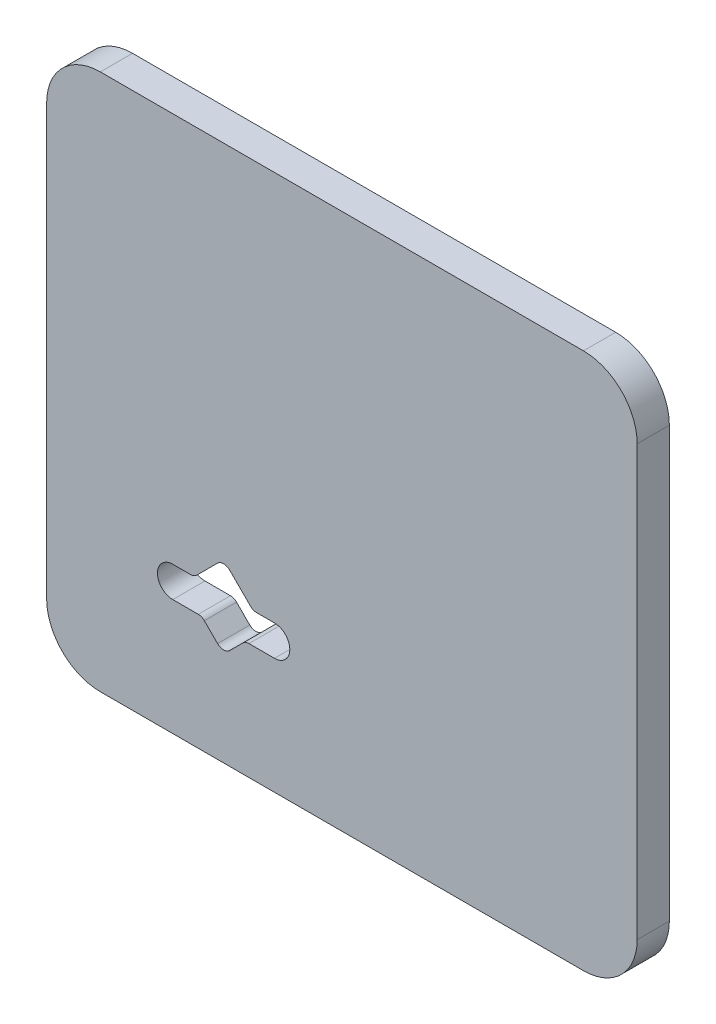
ISO-10303-21;
HEADER;
FILE_DESCRIPTION(('STEP AP214'),'2;1');
FILE_NAME('part.step','',(''),(''),'','','');
FILE_SCHEMA(('AUTOMOTIVE_DESIGN { 1 0 10303 214 1 1 1 1 }'));
ENDSEC;
DATA;
#1=APPLICATION_CONTEXT('core data for automotive mechanical design processes');
#2=APPLICATION_PROTOCOL_DEFINITION('international standard','automotive_design',2000,#1);
#3=PRODUCT_CONTEXT('',#1,'mechanical');
#4=PRODUCT('Part','Part','',(#3));
#5=PRODUCT_RELATED_PRODUCT_CATEGORY('part','',(#4));
#6=PRODUCT_DEFINITION_FORMATION('','',#4);
#7=PRODUCT_DEFINITION_CONTEXT('part definition',#1,'design');
#8=PRODUCT_DEFINITION('design','',#6,#7);
#9=PRODUCT_DEFINITION_SHAPE('','',#8);
#10=(LENGTH_UNIT() NAMED_UNIT(*) SI_UNIT(.MILLI.,.METRE.));
#11=(NAMED_UNIT(*) PLANE_ANGLE_UNIT() SI_UNIT($,.RADIAN.));
#12=(NAMED_UNIT(*) SI_UNIT($,.STERADIAN.) SOLID_ANGLE_UNIT());
#13=UNCERTAINTY_MEASURE_WITH_UNIT(LENGTH_MEASURE(1.E-05),#10,'distance_accuracy_value','');
#14=(GEOMETRIC_REPRESENTATION_CONTEXT(3) GLOBAL_UNCERTAINTY_ASSIGNED_CONTEXT((#13)) GLOBAL_UNIT_ASSIGNED_CONTEXT((#10,
#11,#12)) REPRESENTATION_CONTEXT('',''));
#15=CARTESIAN_POINT('',(0.,0.,0.));
#16=DIRECTION('',(0.,0.,1.));
#17=DIRECTION('',(1.,0.,0.));
#18=AXIS2_PLACEMENT_3D('',#15,#16,#17);
#19=CARTESIAN_POINT('',(6.34999999999999,61.1641820195664,-3.81));
#20=DIRECTION('',(0.,0.,1.));
#21=DIRECTION('',(1.,0.,0.));
#22=AXIS2_PLACEMENT_3D('',#19,#20,#21);
#23=CYLINDRICAL_SURFACE('',#22,6.35);
#24=CARTESIAN_POINT('',(6.34999999999999,61.1641820195664,0.));
#25=DIRECTION('',(0.,0.,1.));
#26=DIRECTION('',(-1.,0.,0.));
#27=AXIS2_PLACEMENT_3D('',#24,#25,#26);
#28=CIRCLE('',#27,6.35);
#29=CARTESIAN_POINT('',(6.34999999999999,67.5141820195664,0.));
#30=VERTEX_POINT('',#29);
#31=CARTESIAN_POINT('',(0.,61.1641820195664,0.));
#32=VERTEX_POINT('',#31);
#33=EDGE_CURVE('E297',#30,#32,#28,.T.);
#34=ORIENTED_EDGE('',*,*,#33,.F.);
#35=DIRECTION('',(0.,0.,1.));
#36=VECTOR('',#35,1.);
#37=CARTESIAN_POINT('',(6.34999999999999,67.5141820195664,-3.81));
#38=LINE('',#37,#36);
#39=CARTESIAN_POINT('',(6.34999999999999,67.5141820195664,-3.81));
#40=VERTEX_POINT('',#39);
#41=EDGE_CURVE('E11',#40,#30,#38,.T.);
#42=ORIENTED_EDGE('',*,*,#41,.F.);
#43=CARTESIAN_POINT('',(6.34999999999999,61.1641820195664,-3.81));
#44=DIRECTION('',(0.,0.,1.));
#45=DIRECTION('',(-1.,0.,0.));
#46=AXIS2_PLACEMENT_3D('',#43,#44,#45);
#47=CIRCLE('',#46,6.35);
#48=CARTESIAN_POINT('',(0.,61.1641820195664,-3.81));
#49=VERTEX_POINT('',#48);
#50=EDGE_CURVE('E325',#40,#49,#47,.T.);
#51=ORIENTED_EDGE('',*,*,#50,.T.);
#52=DIRECTION('',(0.,0.,1.));
#53=VECTOR('',#52,1.);
#54=CARTESIAN_POINT('',(0.,61.1641820195664,-3.81));
#55=LINE('',#54,#53);
#56=EDGE_CURVE('E34',#49,#32,#55,.T.);
#57=ORIENTED_EDGE('',*,*,#56,.T.);
#58=EDGE_LOOP('',(#34,#42,#51,#57));
#59=FACE_BOUND('',#58,.T.);
#60=ADVANCED_FACE('F31',(#59),#23,.T.);
#61=CARTESIAN_POINT('',(6.34999999999999,67.5141820195664,-3.81));
#62=DIRECTION('',(0.,1.,0.));
#63=DIRECTION('',(0.,0.,1.));
#64=AXIS2_PLACEMENT_3D('',#61,#62,#63);
#65=PLANE('',#64);
#66=DIRECTION('',(-1.,0.,0.));
#67=VECTOR('',#66,1.);
#68=CARTESIAN_POINT('',(6.34999999999999,67.5141820195664,0.));
#69=LINE('',#68,#67);
#70=CARTESIAN_POINT('',(63.5,67.5141820195664,0.));
#71=VERTEX_POINT('',#70);
#72=EDGE_CURVE('E329',#71,#30,#69,.T.);
#73=ORIENTED_EDGE('',*,*,#72,.F.);
#74=DIRECTION('',(0.,0.,1.));
#75=VECTOR('',#74,1.);
#76=CARTESIAN_POINT('',(63.5,67.5141820195664,-3.81));
#77=LINE('',#76,#75);
#78=CARTESIAN_POINT('',(63.5,67.5141820195664,-3.81));
#79=VERTEX_POINT('',#78);
#80=EDGE_CURVE('E39',#79,#71,#77,.T.);
#81=ORIENTED_EDGE('',*,*,#80,.F.);
#82=DIRECTION('',(-1.,0.,0.));
#83=VECTOR('',#82,1.);
#84=CARTESIAN_POINT('',(6.34999999999999,67.5141820195664,-3.81));
#85=LINE('',#84,#83);
#86=EDGE_CURVE('E347',#79,#40,#85,.T.);
#87=ORIENTED_EDGE('',*,*,#86,.T.);
#88=ORIENTED_EDGE('',*,*,#41,.T.);
#89=EDGE_LOOP('',(#73,#81,#87,#88));
#90=FACE_BOUND('',#89,.T.);
#91=ADVANCED_FACE('F394',(#90),#65,.T.);
#92=CARTESIAN_POINT('',(63.5,61.1641820195664,-3.81));
#93=DIRECTION('',(0.,0.,1.));
#94=DIRECTION('',(1.,0.,0.));
#95=AXIS2_PLACEMENT_3D('',#92,#93,#94);
#96=CYLINDRICAL_SURFACE('',#95,6.35);
#97=CARTESIAN_POINT('',(63.5,61.1641820195664,0.));
#98=DIRECTION('',(0.,0.,1.));
#99=DIRECTION('',(1.,0.,0.));
#100=AXIS2_PLACEMENT_3D('',#97,#98,#99);
#101=CIRCLE('',#100,6.35);
#102=CARTESIAN_POINT('',(69.85,61.1641820195664,0.));
#103=VERTEX_POINT('',#102);
#104=EDGE_CURVE('E367',#103,#71,#101,.T.);
#105=ORIENTED_EDGE('',*,*,#104,.F.);
#106=DIRECTION('',(0.,0.,1.));
#107=VECTOR('',#106,1.);
#108=CARTESIAN_POINT('',(69.85,61.1641820195664,-3.81));
#109=LINE('',#108,#107);
#110=CARTESIAN_POINT('',(69.85,61.1641820195664,-3.81));
#111=VERTEX_POINT('',#110);
#112=EDGE_CURVE('E373',#111,#103,#109,.T.);
#113=ORIENTED_EDGE('',*,*,#112,.F.);
#114=CARTESIAN_POINT('',(63.5,61.1641820195664,-3.81));
#115=DIRECTION('',(0.,0.,1.));
#116=DIRECTION('',(1.,0.,0.));
#117=AXIS2_PLACEMENT_3D('',#114,#115,#116);
#118=CIRCLE('',#117,6.35);
#119=EDGE_CURVE('E344',#111,#79,#118,.T.);
#120=ORIENTED_EDGE('',*,*,#119,.T.);
#121=ORIENTED_EDGE('',*,*,#80,.T.);
#122=EDGE_LOOP('',(#105,#113,#120,#121));
#123=FACE_BOUND('',#122,.T.);
#124=ADVANCED_FACE('F413',(#123),#96,.T.);
#125=CARTESIAN_POINT('',(69.85,61.1641820195664,-3.81));
#126=DIRECTION('',(1.,0.,0.));
#127=DIRECTION('',(0.,1.,0.));
#128=AXIS2_PLACEMENT_3D('',#125,#126,#127);
#129=PLANE('',#128);
#130=DIRECTION('',(0.,1.,0.));
#131=VECTOR('',#130,1.);
#132=CARTESIAN_POINT('',(69.85,61.1641820195664,0.));
#133=LINE('',#132,#131);
#134=CARTESIAN_POINT('',(69.85,10.3641820195664,0.));
#135=VERTEX_POINT('',#134);
#136=EDGE_CURVE('E364',#135,#103,#133,.T.);
#137=ORIENTED_EDGE('',*,*,#136,.F.);
#138=DIRECTION('',(0.,0.,1.));
#139=VECTOR('',#138,1.);
#140=CARTESIAN_POINT('',(69.85,10.3641820195664,-3.81));
#141=LINE('',#140,#139);
#142=CARTESIAN_POINT('',(69.85,10.3641820195664,-3.81));
#143=VERTEX_POINT('',#142);
#144=EDGE_CURVE('E375',#143,#135,#141,.T.);
#145=ORIENTED_EDGE('',*,*,#144,.F.);
#146=DIRECTION('',(0.,1.,0.));
#147=VECTOR('',#146,1.);
#148=CARTESIAN_POINT('',(69.85,61.1641820195664,-3.81));
#149=LINE('',#148,#147);
#150=EDGE_CURVE('E341',#143,#111,#149,.T.);
#151=ORIENTED_EDGE('',*,*,#150,.T.);
#152=ORIENTED_EDGE('',*,*,#112,.T.);
#153=EDGE_LOOP('',(#137,#145,#151,#152));
#154=FACE_BOUND('',#153,.T.);
#155=ADVANCED_FACE('F411',(#154),#129,.T.);
#156=CARTESIAN_POINT('',(63.5,10.3641820195664,-3.81));
#157=DIRECTION('',(0.,0.,1.));
#158=DIRECTION('',(1.,0.,0.));
#159=AXIS2_PLACEMENT_3D('',#156,#157,#158);
#160=CYLINDRICAL_SURFACE('',#159,6.35);
#161=CARTESIAN_POINT('',(63.5,10.3641820195664,0.));
#162=DIRECTION('',(0.,0.,1.));
#163=DIRECTION('',(1.,0.,0.));
#164=AXIS2_PLACEMENT_3D('',#161,#162,#163);
#165=CIRCLE('',#164,6.35);
#166=CARTESIAN_POINT('',(63.5,4.01418201956642,0.));
#167=VERTEX_POINT('',#166);
#168=EDGE_CURVE('E361',#167,#135,#165,.T.);
#169=ORIENTED_EDGE('',*,*,#168,.F.);
#170=DIRECTION('',(0.,0.,1.));
#171=VECTOR('',#170,1.);
#172=CARTESIAN_POINT('',(63.5,4.01418201956642,-3.81));
#173=LINE('',#172,#171);
#174=CARTESIAN_POINT('',(63.5,4.01418201956642,-3.81));
#175=VERTEX_POINT('',#174);
#176=EDGE_CURVE('E377',#175,#167,#173,.T.);
#177=ORIENTED_EDGE('',*,*,#176,.F.);
#178=CARTESIAN_POINT('',(63.5,10.3641820195664,-3.81));
#179=DIRECTION('',(0.,0.,1.));
#180=DIRECTION('',(1.,0.,0.));
#181=AXIS2_PLACEMENT_3D('',#178,#179,#180);
#182=CIRCLE('',#181,6.35);
#183=EDGE_CURVE('E338',#175,#143,#182,.T.);
#184=ORIENTED_EDGE('',*,*,#183,.T.);
#185=ORIENTED_EDGE('',*,*,#144,.T.);
#186=EDGE_LOOP('',(#169,#177,#184,#185));
#187=FACE_BOUND('',#186,.T.);
#188=ADVANCED_FACE('F407',(#187),#160,.T.);
#189=CARTESIAN_POINT('',(63.5,4.01418201956642,-3.81));
#190=DIRECTION('',(0.,-1.,0.));
#191=DIRECTION('',(1.,0.,0.));
#192=AXIS2_PLACEMENT_3D('',#189,#190,#191);
#193=PLANE('',#192);
#194=DIRECTION('',(1.,0.,0.));
#195=VECTOR('',#194,1.);
#196=CARTESIAN_POINT('',(63.5,4.01418201956642,0.));
#197=LINE('',#196,#195);
#198=CARTESIAN_POINT('',(6.35000000000004,4.01418201956642,0.));
#199=VERTEX_POINT('',#198);
#200=EDGE_CURVE('E358',#199,#167,#197,.T.);
#201=ORIENTED_EDGE('',*,*,#200,.F.);
#202=DIRECTION('',(0.,0.,1.));
#203=VECTOR('',#202,1.);
#204=CARTESIAN_POINT('',(6.35000000000004,4.01418201956642,-3.81));
#205=LINE('',#204,#203);
#206=CARTESIAN_POINT('',(6.35000000000004,4.01418201956642,-3.81));
#207=VERTEX_POINT('',#206);
#208=EDGE_CURVE('E379',#207,#199,#205,.T.);
#209=ORIENTED_EDGE('',*,*,#208,.F.);
#210=DIRECTION('',(1.,0.,0.));
#211=VECTOR('',#210,1.);
#212=CARTESIAN_POINT('',(63.5,4.01418201956642,-3.81));
#213=LINE('',#212,#211);
#214=EDGE_CURVE('E335',#207,#175,#213,.T.);
#215=ORIENTED_EDGE('',*,*,#214,.T.);
#216=ORIENTED_EDGE('',*,*,#176,.T.);
#217=EDGE_LOOP('',(#201,#209,#215,#216));
#218=FACE_BOUND('',#217,.T.);
#219=ADVANCED_FACE('F405',(#218),#193,.T.);
#220=CARTESIAN_POINT('',(6.35,10.3641820195664,-3.81));
#221=DIRECTION('',(0.,0.,1.));
#222=DIRECTION('',(1.,0.,0.));
#223=AXIS2_PLACEMENT_3D('',#220,#221,#222);
#224=CYLINDRICAL_SURFACE('',#223,6.35);
#225=CARTESIAN_POINT('',(6.35,10.3641820195664,0.));
#226=DIRECTION('',(0.,0.,1.));
#227=DIRECTION('',(1.,0.,0.));
#228=AXIS2_PLACEMENT_3D('',#225,#226,#227);
#229=CIRCLE('',#228,6.35);
#230=CARTESIAN_POINT('',(0.,10.3641820195665,0.));
#231=VERTEX_POINT('',#230);
#232=EDGE_CURVE('E355',#231,#199,#229,.T.);
#233=ORIENTED_EDGE('',*,*,#232,.F.);
#234=DIRECTION('',(0.,0.,1.));
#235=VECTOR('',#234,1.);
#236=CARTESIAN_POINT('',(0.,10.3641820195665,-3.81));
#237=LINE('',#236,#235);
#238=CARTESIAN_POINT('',(0.,10.3641820195665,-3.81));
#239=VERTEX_POINT('',#238);
#240=EDGE_CURVE('E380',#239,#231,#237,.T.);
#241=ORIENTED_EDGE('',*,*,#240,.F.);
#242=CARTESIAN_POINT('',(6.35,10.3641820195664,-3.81));
#243=DIRECTION('',(0.,0.,1.));
#244=DIRECTION('',(1.,0.,0.));
#245=AXIS2_PLACEMENT_3D('',#242,#243,#244);
#246=CIRCLE('',#245,6.35);
#247=EDGE_CURVE('E332',#239,#207,#246,.T.);
#248=ORIENTED_EDGE('',*,*,#247,.T.);
#249=ORIENTED_EDGE('',*,*,#208,.T.);
#250=EDGE_LOOP('',(#233,#241,#248,#249));
#251=FACE_BOUND('',#250,.T.);
#252=ADVANCED_FACE('F401',(#251),#224,.T.);
#253=CARTESIAN_POINT('',(0.,10.3641820195665,-3.81));
#254=DIRECTION('',(-1.,0.,0.));
#255=DIRECTION('',(0.,-1.,0.));
#256=AXIS2_PLACEMENT_3D('',#253,#254,#255);
#257=PLANE('',#256);
#258=DIRECTION('',(0.,-1.,0.));
#259=VECTOR('',#258,1.);
#260=CARTESIAN_POINT('',(0.,10.3641820195665,0.));
#261=LINE('',#260,#259);
#262=EDGE_CURVE('E352',#32,#231,#261,.T.);
#263=ORIENTED_EDGE('',*,*,#262,.F.);
#264=ORIENTED_EDGE('',*,*,#56,.F.);
#265=DIRECTION('',(0.,-1.,0.));
#266=VECTOR('',#265,1.);
#267=CARTESIAN_POINT('',(0.,10.3641820195665,-3.81));
#268=LINE('',#267,#266);
#269=EDGE_CURVE('E328',#49,#239,#268,.T.);
#270=ORIENTED_EDGE('',*,*,#269,.T.);
#271=ORIENTED_EDGE('',*,*,#240,.T.);
#272=EDGE_LOOP('',(#263,#264,#270,#271));
#273=FACE_BOUND('',#272,.T.);
#274=ADVANCED_FACE('F388',(#273),#257,.T.);
#275=CARTESIAN_POINT('',(6.34999999999999,61.1641820195664,-3.81));
#276=DIRECTION('',(0.,0.,-1.));
#277=DIRECTION('',(-1.,0.,0.));
#278=AXIS2_PLACEMENT_3D('',#275,#276,#277);
#279=PLANE('',#278);
#280=CARTESIAN_POINT('',(26.9522558544265,19.5518149122751,-3.81));
#281=DIRECTION('',(0.,0.,1.));
#282=DIRECTION('',(1.,0.,0.));
#283=AXIS2_PLACEMENT_3D('',#280,#281,#282);
#284=CIRCLE('',#283,1.80981111499001);
#285=CARTESIAN_POINT('',(26.9522558544265,17.7420037972851,-3.81));
#286=VERTEX_POINT('',#285);
#287=CARTESIAN_POINT('',(26.9522558544265,21.3616260272651,-3.81));
#288=VERTEX_POINT('',#287);
#289=EDGE_CURVE('E194',#286,#288,#284,.T.);
#290=ORIENTED_EDGE('',*,*,#289,.T.);
#291=DIRECTION('',(-1.,0.,0.));
#292=VECTOR('',#291,1.);
#293=CARTESIAN_POINT('',(24.8330968337976,21.3616260272651,-3.81));
#294=LINE('',#293,#292);
#295=CARTESIAN_POINT('',(24.8330968337976,21.3616260272651,-3.81));
#296=VERTEX_POINT('',#295);
#297=EDGE_CURVE('E203',#288,#296,#294,.T.);
#298=ORIENTED_EDGE('',*,*,#297,.T.);
#299=CARTESIAN_POINT('',(24.8330968337976,22.3776260272651,-3.81));
#300=DIRECTION('',(0.,0.,-1.));
#301=DIRECTION('',(1.,0.,0.));
#302=AXIS2_PLACEMENT_3D('',#299,#300,#301);
#303=CIRCLE('',#302,1.016);
#304=CARTESIAN_POINT('',(24.114676344112,21.6592055375796,-3.81));
#305=VERTEX_POINT('',#304);
#306=EDGE_CURVE('E47',#296,#305,#303,.T.);
#307=ORIENTED_EDGE('',*,*,#306,.T.);
#308=DIRECTION('',(-0.707106781186548,0.707106781186546,0.));
#309=VECTOR('',#308,1.);
#310=CARTESIAN_POINT('',(24.114676344112,21.6592055375796,-3.81));
#311=LINE('',#310,#309);
#312=CARTESIAN_POINT('',(21.6527611399269,24.1211207417647,-3.81));
#313=VERTEX_POINT('',#312);
#314=EDGE_CURVE('E218',#305,#313,#311,.T.);
#315=ORIENTED_EDGE('',*,*,#314,.T.);
#316=CARTESIAN_POINT('',(20.9343406502414,23.4027002520792,-3.81));
#317=DIRECTION('',(0.,0.,1.));
#318=DIRECTION('',(-1.,0.,0.));
#319=AXIS2_PLACEMENT_3D('',#316,#317,#318);
#320=CIRCLE('',#319,1.016);
#321=CARTESIAN_POINT('',(20.2159201605558,24.1211207417647,-3.81));
#322=VERTEX_POINT('',#321);
#323=EDGE_CURVE('E221',#313,#322,#320,.T.);
#324=ORIENTED_EDGE('',*,*,#323,.T.);
#325=DIRECTION('',(-0.707106781186547,-0.707106781186547,0.));
#326=VECTOR('',#325,1.);
#327=CARTESIAN_POINT('',(20.2159201605558,24.1211207417647,-3.81));
#328=LINE('',#327,#326);
#329=CARTESIAN_POINT('',(17.7540049563707,21.6592055375796,-3.81));
#330=VERTEX_POINT('',#329);
#331=EDGE_CURVE('E224',#322,#330,#328,.T.);
#332=ORIENTED_EDGE('',*,*,#331,.T.);
#333=CARTESIAN_POINT('',(17.0355844666852,22.3776260272651,-3.81));
#334=DIRECTION('',(0.,0.,-1.));
#335=DIRECTION('',(-1.,0.,0.));
#336=AXIS2_PLACEMENT_3D('',#333,#334,#335);
#337=CIRCLE('',#336,1.016);
#338=CARTESIAN_POINT('',(17.0355844666852,21.3616260272651,-3.81));
#339=VERTEX_POINT('',#338);
#340=EDGE_CURVE('E227',#330,#339,#337,.T.);
#341=ORIENTED_EDGE('',*,*,#340,.T.);
#342=DIRECTION('',(-1.,0.,0.));
#343=VECTOR('',#342,1.);
#344=CARTESIAN_POINT('',(14.9164254460562,21.3616260272651,-3.81));
#345=LINE('',#344,#343);
#346=CARTESIAN_POINT('',(14.9164254460562,21.3616260272651,-3.81));
#347=VERTEX_POINT('',#346);
#348=EDGE_CURVE('E230',#339,#347,#345,.T.);
#349=ORIENTED_EDGE('',*,*,#348,.T.);
#350=CARTESIAN_POINT('',(14.9164254460562,19.5518149122751,-3.81));
#351=DIRECTION('',(0.,0.,1.));
#352=DIRECTION('',(1.,0.,0.));
#353=AXIS2_PLACEMENT_3D('',#350,#351,#352);
#354=CIRCLE('',#353,1.80981111499001);
#355=CARTESIAN_POINT('',(14.9164254460562,17.7420037972851,-3.81));
#356=VERTEX_POINT('',#355);
#357=EDGE_CURVE('E233',#347,#356,#354,.T.);
#358=ORIENTED_EDGE('',*,*,#357,.T.);
#359=DIRECTION('',(1.,0.,0.));
#360=VECTOR('',#359,1.);
#361=CARTESIAN_POINT('',(14.9164254460562,17.7420037972851,-3.81));
#362=LINE('',#361,#360);
#363=CARTESIAN_POINT('',(17.9383929701685,17.7420037972851,-3.81));
#364=VERTEX_POINT('',#363);
#365=EDGE_CURVE('E236',#356,#364,#362,.T.);
#366=ORIENTED_EDGE('',*,*,#365,.T.);
#367=CARTESIAN_POINT('',(17.9383929701685,16.7260037972851,-3.81));
#368=DIRECTION('',(0.,0.,-1.));
#369=DIRECTION('',(1.,0.,0.));
#370=AXIS2_PLACEMENT_3D('',#367,#368,#369);
#371=CIRCLE('',#370,1.016);
#372=CARTESIAN_POINT('',(18.656813459854,17.4444242869706,-3.81));
#373=VERTEX_POINT('',#372);
#374=EDGE_CURVE('E239',#364,#373,#371,.T.);
#375=ORIENTED_EDGE('',*,*,#374,.T.);
#376=DIRECTION('',(0.707106781186548,-0.707106781186548,0.));
#377=VECTOR('',#376,1.);
#378=CARTESIAN_POINT('',(18.656813459854,17.4444242869706,-3.81));
#379=LINE('',#378,#377);
#380=CARTESIAN_POINT('',(20.2159201605558,15.8853175862688,-3.81));
#381=VERTEX_POINT('',#380);
#382=EDGE_CURVE('E242',#373,#381,#379,.T.);
#383=ORIENTED_EDGE('',*,*,#382,.T.);
#384=CARTESIAN_POINT('',(20.9343406502414,16.6037380759543,-3.81));
#385=DIRECTION('',(0.,0.,1.));
#386=DIRECTION('',(1.,0.,0.));
#387=AXIS2_PLACEMENT_3D('',#384,#385,#386);
#388=CIRCLE('',#387,1.016);
#389=CARTESIAN_POINT('',(21.6527611399269,15.8853175862688,-3.81));
#390=VERTEX_POINT('',#389);
#391=EDGE_CURVE('E245',#381,#390,#388,.T.);
#392=ORIENTED_EDGE('',*,*,#391,.T.);
#393=DIRECTION('',(0.707106781186546,0.707106781186549,0.));
#394=VECTOR('',#393,1.);
#395=CARTESIAN_POINT('',(21.6527611399269,15.8853175862688,-3.81));
#396=LINE('',#395,#394);
#397=CARTESIAN_POINT('',(23.2118678406287,17.4444242869706,-3.81));
#398=VERTEX_POINT('',#397);
#399=EDGE_CURVE('E248',#390,#398,#396,.T.);
#400=ORIENTED_EDGE('',*,*,#399,.T.);
#401=CARTESIAN_POINT('',(23.9302883303142,16.7260037972851,-3.81));
#402=DIRECTION('',(0.,0.,-1.));
#403=DIRECTION('',(-1.,0.,0.));
#404=AXIS2_PLACEMENT_3D('',#401,#402,#403);
#405=CIRCLE('',#404,1.016);
#406=CARTESIAN_POINT('',(23.9302883303142,17.7420037972851,-3.81));
#407=VERTEX_POINT('',#406);
#408=EDGE_CURVE('E251',#398,#407,#405,.T.);
#409=ORIENTED_EDGE('',*,*,#408,.T.);
#410=DIRECTION('',(1.,0.,0.));
#411=VECTOR('',#410,1.);
#412=CARTESIAN_POINT('',(23.9302883303142,17.7420037972851,-3.81));
#413=LINE('',#412,#411);
#414=EDGE_CURVE('E200',#407,#286,#413,.T.);
#415=ORIENTED_EDGE('',*,*,#414,.T.);
#416=EDGE_LOOP('',(#290,#298,#307,#315,#324,#332,#341,#349,#358,#366,#375,#383,#392,#400,#409,#415));
#417=FACE_BOUND('',#416,.T.);
#418=ORIENTED_EDGE('',*,*,#50,.F.);
#419=ORIENTED_EDGE('',*,*,#86,.F.);
#420=ORIENTED_EDGE('',*,*,#119,.F.);
#421=ORIENTED_EDGE('',*,*,#150,.F.);
#422=ORIENTED_EDGE('',*,*,#183,.F.);
#423=ORIENTED_EDGE('',*,*,#214,.F.);
#424=ORIENTED_EDGE('',*,*,#247,.F.);
#425=ORIENTED_EDGE('',*,*,#269,.F.);
#426=EDGE_LOOP('',(#418,#419,#420,#421,#422,#423,#424,#425));
#427=FACE_BOUND('',#426,.T.);
#428=ADVANCED_FACE('F207',(#417,#427),#279,.T.);
#429=CARTESIAN_POINT('',(6.34999999999999,61.1641820195664,0.));
#430=DIRECTION('',(0.,0.,-1.));
#431=DIRECTION('',(-1.,0.,0.));
#432=AXIS2_PLACEMENT_3D('',#429,#430,#431);
#433=PLANE('',#432);
#434=DIRECTION('',(-1.,0.,0.));
#435=VECTOR('',#434,1.);
#436=CARTESIAN_POINT('',(24.8330968337976,21.3616260272651,0.));
#437=LINE('',#436,#435);
#438=CARTESIAN_POINT('',(26.9522558544265,21.3616260272651,0.));
#439=VERTEX_POINT('',#438);
#440=CARTESIAN_POINT('',(24.8330968337976,21.3616260272651,0.));
#441=VERTEX_POINT('',#440);
#442=EDGE_CURVE('E255',#439,#441,#437,.T.);
#443=ORIENTED_EDGE('',*,*,#442,.F.);
#444=CARTESIAN_POINT('',(26.9522558544265,19.5518149122751,0.));
#445=DIRECTION('',(0.,0.,1.));
#446=DIRECTION('',(1.,0.,0.));
#447=AXIS2_PLACEMENT_3D('',#444,#445,#446);
#448=CIRCLE('',#447,1.80981111499001);
#449=CARTESIAN_POINT('',(26.9522558544265,17.7420037972851,0.));
#450=VERTEX_POINT('',#449);
#451=EDGE_CURVE('E55',#450,#439,#448,.T.);
#452=ORIENTED_EDGE('',*,*,#451,.F.);
#453=DIRECTION('',(1.,0.,0.));
#454=VECTOR('',#453,1.);
#455=CARTESIAN_POINT('',(23.9302883303142,17.7420037972851,0.));
#456=LINE('',#455,#454);
#457=CARTESIAN_POINT('',(23.9302883303142,17.7420037972851,0.));
#458=VERTEX_POINT('',#457);
#459=EDGE_CURVE('E211',#458,#450,#456,.T.);
#460=ORIENTED_EDGE('',*,*,#459,.F.);
#461=CARTESIAN_POINT('',(23.9302883303142,16.7260037972851,0.));
#462=DIRECTION('',(0.,0.,-1.));
#463=DIRECTION('',(-1.,0.,0.));
#464=AXIS2_PLACEMENT_3D('',#461,#462,#463);
#465=CIRCLE('',#464,1.016);
#466=CARTESIAN_POINT('',(23.2118678406287,17.4444242869706,0.));
#467=VERTEX_POINT('',#466);
#468=EDGE_CURVE('E214',#467,#458,#465,.T.);
#469=ORIENTED_EDGE('',*,*,#468,.F.);
#470=DIRECTION('',(0.707106781186546,0.707106781186549,0.));
#471=VECTOR('',#470,1.);
#472=CARTESIAN_POINT('',(21.6527611399269,15.8853175862688,0.));
#473=LINE('',#472,#471);
#474=CARTESIAN_POINT('',(21.6527611399269,15.8853175862688,0.));
#475=VERTEX_POINT('',#474);
#476=EDGE_CURVE('E290',#475,#467,#473,.T.);
#477=ORIENTED_EDGE('',*,*,#476,.F.);
#478=CARTESIAN_POINT('',(20.9343406502414,16.6037380759543,0.));
#479=DIRECTION('',(0.,0.,1.));
#480=DIRECTION('',(1.,0.,0.));
#481=AXIS2_PLACEMENT_3D('',#478,#479,#480);
#482=CIRCLE('',#481,1.016);
#483=CARTESIAN_POINT('',(20.2159201605558,15.8853175862688,0.));
#484=VERTEX_POINT('',#483);
#485=EDGE_CURVE('E287',#484,#475,#482,.T.);
#486=ORIENTED_EDGE('',*,*,#485,.F.);
#487=DIRECTION('',(0.707106781186548,-0.707106781186548,0.));
#488=VECTOR('',#487,1.);
#489=CARTESIAN_POINT('',(18.656813459854,17.4444242869706,0.));
#490=LINE('',#489,#488);
#491=CARTESIAN_POINT('',(18.656813459854,17.4444242869706,0.));
#492=VERTEX_POINT('',#491);
#493=EDGE_CURVE('E284',#492,#484,#490,.T.);
#494=ORIENTED_EDGE('',*,*,#493,.F.);
#495=CARTESIAN_POINT('',(17.9383929701685,16.7260037972851,0.));
#496=DIRECTION('',(0.,0.,-1.));
#497=DIRECTION('',(1.,0.,0.));
#498=AXIS2_PLACEMENT_3D('',#495,#496,#497);
#499=CIRCLE('',#498,1.016);
#500=CARTESIAN_POINT('',(17.9383929701685,17.7420037972851,0.));
#501=VERTEX_POINT('',#500);
#502=EDGE_CURVE('E281',#501,#492,#499,.T.);
#503=ORIENTED_EDGE('',*,*,#502,.F.);
#504=DIRECTION('',(1.,0.,0.));
#505=VECTOR('',#504,1.);
#506=CARTESIAN_POINT('',(14.9164254460562,17.7420037972851,0.));
#507=LINE('',#506,#505);
#508=CARTESIAN_POINT('',(14.9164254460562,17.7420037972851,0.));
#509=VERTEX_POINT('',#508);
#510=EDGE_CURVE('E278',#509,#501,#507,.T.);
#511=ORIENTED_EDGE('',*,*,#510,.F.);
#512=CARTESIAN_POINT('',(14.9164254460562,19.5518149122751,0.));
#513=DIRECTION('',(0.,0.,1.));
#514=DIRECTION('',(1.,0.,0.));
#515=AXIS2_PLACEMENT_3D('',#512,#513,#514);
#516=CIRCLE('',#515,1.80981111499001);
#517=CARTESIAN_POINT('',(14.9164254460562,21.3616260272651,0.));
#518=VERTEX_POINT('',#517);
#519=EDGE_CURVE('E275',#518,#509,#516,.T.);
#520=ORIENTED_EDGE('',*,*,#519,.F.);
#521=DIRECTION('',(-1.,0.,0.));
#522=VECTOR('',#521,1.);
#523=CARTESIAN_POINT('',(14.9164254460562,21.3616260272651,0.));
#524=LINE('',#523,#522);
#525=CARTESIAN_POINT('',(17.0355844666852,21.3616260272651,0.));
#526=VERTEX_POINT('',#525);
#527=EDGE_CURVE('E272',#526,#518,#524,.T.);
#528=ORIENTED_EDGE('',*,*,#527,.F.);
#529=CARTESIAN_POINT('',(17.0355844666852,22.3776260272651,0.));
#530=DIRECTION('',(0.,0.,-1.));
#531=DIRECTION('',(-1.,0.,0.));
#532=AXIS2_PLACEMENT_3D('',#529,#530,#531);
#533=CIRCLE('',#532,1.016);
#534=CARTESIAN_POINT('',(17.7540049563707,21.6592055375796,0.));
#535=VERTEX_POINT('',#534);
#536=EDGE_CURVE('E269',#535,#526,#533,.T.);
#537=ORIENTED_EDGE('',*,*,#536,.F.);
#538=DIRECTION('',(-0.707106781186547,-0.707106781186547,0.));
#539=VECTOR('',#538,1.);
#540=CARTESIAN_POINT('',(20.2159201605558,24.1211207417647,0.));
#541=LINE('',#540,#539);
#542=CARTESIAN_POINT('',(20.2159201605558,24.1211207417647,0.));
#543=VERTEX_POINT('',#542);
#544=EDGE_CURVE('E266',#543,#535,#541,.T.);
#545=ORIENTED_EDGE('',*,*,#544,.F.);
#546=CARTESIAN_POINT('',(20.9343406502414,23.4027002520792,0.));
#547=DIRECTION('',(0.,0.,1.));
#548=DIRECTION('',(-1.,0.,0.));
#549=AXIS2_PLACEMENT_3D('',#546,#547,#548);
#550=CIRCLE('',#549,1.016);
#551=CARTESIAN_POINT('',(21.6527611399269,24.1211207417647,0.));
#552=VERTEX_POINT('',#551);
#553=EDGE_CURVE('E263',#552,#543,#550,.T.);
#554=ORIENTED_EDGE('',*,*,#553,.F.);
#555=DIRECTION('',(-0.707106781186548,0.707106781186546,0.));
#556=VECTOR('',#555,1.);
#557=CARTESIAN_POINT('',(24.114676344112,21.6592055375796,0.));
#558=LINE('',#557,#556);
#559=CARTESIAN_POINT('',(24.114676344112,21.6592055375796,0.));
#560=VERTEX_POINT('',#559);
#561=EDGE_CURVE('E260',#560,#552,#558,.T.);
#562=ORIENTED_EDGE('',*,*,#561,.F.);
#563=CARTESIAN_POINT('',(24.8330968337976,22.3776260272651,0.));
#564=DIRECTION('',(0.,0.,-1.));
#565=DIRECTION('',(1.,0.,0.));
#566=AXIS2_PLACEMENT_3D('',#563,#564,#565);
#567=CIRCLE('',#566,1.016);
#568=EDGE_CURVE('E257',#441,#560,#567,.T.);
#569=ORIENTED_EDGE('',*,*,#568,.F.);
#570=EDGE_LOOP('',(#443,#452,#460,#469,#477,#486,#494,#503,#511,#520,#528,#537,#545,#554,#562,#569));
#571=FACE_BOUND('',#570,.T.);
#572=ORIENTED_EDGE('',*,*,#33,.T.);
#573=ORIENTED_EDGE('',*,*,#262,.T.);
#574=ORIENTED_EDGE('',*,*,#232,.T.);
#575=ORIENTED_EDGE('',*,*,#200,.T.);
#576=ORIENTED_EDGE('',*,*,#168,.T.);
#577=ORIENTED_EDGE('',*,*,#136,.T.);
#578=ORIENTED_EDGE('',*,*,#104,.T.);
#579=ORIENTED_EDGE('',*,*,#72,.T.);
#580=EDGE_LOOP('',(#572,#573,#574,#575,#576,#577,#578,#579));
#581=FACE_BOUND('',#580,.T.);
#582=ADVANCED_FACE('F390',(#571,#581),#433,.F.);
#583=CARTESIAN_POINT('',(26.9522558544265,19.5518149122751,-3.81));
#584=DIRECTION('',(0.,0.,1.));
#585=DIRECTION('',(1.,0.,0.));
#586=AXIS2_PLACEMENT_3D('',#583,#584,#585);
#587=CYLINDRICAL_SURFACE('',#586,1.80981111499001);
#588=ORIENTED_EDGE('',*,*,#451,.T.);
#589=DIRECTION('',(0.,0.,1.));
#590=VECTOR('',#589,1.);
#591=CARTESIAN_POINT('',(26.9522558544265,21.3616260272651,-3.81));
#592=LINE('',#591,#590);
#593=EDGE_CURVE('E190',#288,#439,#592,.T.);
#594=ORIENTED_EDGE('',*,*,#593,.F.);
#595=ORIENTED_EDGE('',*,*,#289,.F.);
#596=DIRECTION('',(0.,0.,1.));
#597=VECTOR('',#596,1.);
#598=CARTESIAN_POINT('',(26.9522558544265,17.7420037972851,-3.81));
#599=LINE('',#598,#597);
#600=EDGE_CURVE('E295',#286,#450,#599,.T.);
#601=ORIENTED_EDGE('',*,*,#600,.T.);
#602=EDGE_LOOP('',(#588,#594,#595,#601));
#603=FACE_BOUND('',#602,.T.);
#604=ADVANCED_FACE('F192',(#603),#587,.F.);
#605=CARTESIAN_POINT('',(23.9302883303142,17.7420037972851,-3.81));
#606=DIRECTION('',(0.,-1.,0.));
#607=DIRECTION('',(0.,0.,-1.));
#608=AXIS2_PLACEMENT_3D('',#605,#606,#607);
#609=PLANE('',#608);
#610=ORIENTED_EDGE('',*,*,#459,.T.);
#611=ORIENTED_EDGE('',*,*,#600,.F.);
#612=ORIENTED_EDGE('',*,*,#414,.F.);
#613=DIRECTION('',(0.,0.,1.));
#614=VECTOR('',#613,1.);
#615=CARTESIAN_POINT('',(23.9302883303142,17.7420037972851,-3.81));
#616=LINE('',#615,#614);
#617=EDGE_CURVE('E298',#407,#458,#616,.T.);
#618=ORIENTED_EDGE('',*,*,#617,.T.);
#619=EDGE_LOOP('',(#610,#611,#612,#618));
#620=FACE_BOUND('',#619,.T.);
#621=ADVANCED_FACE('F496',(#620),#609,.F.);
#622=CARTESIAN_POINT('',(23.9302883303142,16.7260037972851,-3.81));
#623=DIRECTION('',(0.,0.,1.));
#624=DIRECTION('',(1.,0.,0.));
#625=AXIS2_PLACEMENT_3D('',#622,#623,#624);
#626=CYLINDRICAL_SURFACE('',#625,1.016);
#627=ORIENTED_EDGE('',*,*,#468,.T.);
#628=ORIENTED_EDGE('',*,*,#617,.F.);
#629=ORIENTED_EDGE('',*,*,#408,.F.);
#630=DIRECTION('',(0.,0.,1.));
#631=VECTOR('',#630,1.);
#632=CARTESIAN_POINT('',(23.2118678406287,17.4444242869706,-3.81));
#633=LINE('',#632,#631);
#634=EDGE_CURVE('E300',#398,#467,#633,.T.);
#635=ORIENTED_EDGE('',*,*,#634,.T.);
#636=EDGE_LOOP('',(#627,#628,#629,#635));
#637=FACE_BOUND('',#636,.T.);
#638=ADVANCED_FACE('F505',(#637),#626,.T.);
#639=CARTESIAN_POINT('',(21.6527611399269,15.8853175862688,-3.81));
#640=DIRECTION('',(0.707106781186549,-0.707106781186546,0.));
#641=DIRECTION('',(0.707106781186546,0.707106781186549,0.));
#642=AXIS2_PLACEMENT_3D('',#639,#640,#641);
#643=PLANE('',#642);
#644=ORIENTED_EDGE('',*,*,#476,.T.);
#645=ORIENTED_EDGE('',*,*,#634,.F.);
#646=ORIENTED_EDGE('',*,*,#399,.F.);
#647=DIRECTION('',(0.,0.,1.));
#648=VECTOR('',#647,1.);
#649=CARTESIAN_POINT('',(21.6527611399269,15.8853175862688,-3.81));
#650=LINE('',#649,#648);
#651=EDGE_CURVE('E302',#390,#475,#650,.T.);
#652=ORIENTED_EDGE('',*,*,#651,.T.);
#653=EDGE_LOOP('',(#644,#645,#646,#652));
#654=FACE_BOUND('',#653,.T.);
#655=ADVANCED_FACE('F515',(#654),#643,.F.);
#656=CARTESIAN_POINT('',(20.9343406502414,16.6037380759543,-3.81));
#657=DIRECTION('',(0.,0.,1.));
#658=DIRECTION('',(1.,0.,0.));
#659=AXIS2_PLACEMENT_3D('',#656,#657,#658);
#660=CYLINDRICAL_SURFACE('',#659,1.016);
#661=ORIENTED_EDGE('',*,*,#485,.T.);
#662=ORIENTED_EDGE('',*,*,#651,.F.);
#663=ORIENTED_EDGE('',*,*,#391,.F.);
#664=DIRECTION('',(0.,0.,1.));
#665=VECTOR('',#664,1.);
#666=CARTESIAN_POINT('',(20.2159201605558,15.8853175862688,-3.81));
#667=LINE('',#666,#665);
#668=EDGE_CURVE('E304',#381,#484,#667,.T.);
#669=ORIENTED_EDGE('',*,*,#668,.T.);
#670=EDGE_LOOP('',(#661,#662,#663,#669));
#671=FACE_BOUND('',#670,.T.);
#672=ADVANCED_FACE('F525',(#671),#660,.F.);
#673=CARTESIAN_POINT('',(18.656813459854,17.4444242869706,-3.81));
#674=DIRECTION('',(-0.707106781186548,-0.707106781186548,0.));
#675=DIRECTION('',(0.707106781186548,-0.707106781186548,0.));
#676=AXIS2_PLACEMENT_3D('',#673,#674,#675);
#677=PLANE('',#676);
#678=ORIENTED_EDGE('',*,*,#493,.T.);
#679=ORIENTED_EDGE('',*,*,#668,.F.);
#680=ORIENTED_EDGE('',*,*,#382,.F.);
#681=DIRECTION('',(0.,0.,1.));
#682=VECTOR('',#681,1.);
#683=CARTESIAN_POINT('',(18.656813459854,17.4444242869706,-3.81));
#684=LINE('',#683,#682);
#685=EDGE_CURVE('E306',#373,#492,#684,.T.);
#686=ORIENTED_EDGE('',*,*,#685,.T.);
#687=EDGE_LOOP('',(#678,#679,#680,#686));
#688=FACE_BOUND('',#687,.T.);
#689=ADVANCED_FACE('F535',(#688),#677,.F.);
#690=CARTESIAN_POINT('',(17.9383929701685,16.7260037972851,-3.81));
#691=DIRECTION('',(0.,0.,1.));
#692=DIRECTION('',(1.,0.,0.));
#693=AXIS2_PLACEMENT_3D('',#690,#691,#692);
#694=CYLINDRICAL_SURFACE('',#693,1.016);
#695=ORIENTED_EDGE('',*,*,#502,.T.);
#696=ORIENTED_EDGE('',*,*,#685,.F.);
#697=ORIENTED_EDGE('',*,*,#374,.F.);
#698=DIRECTION('',(0.,0.,1.));
#699=VECTOR('',#698,1.);
#700=CARTESIAN_POINT('',(17.9383929701685,17.7420037972851,-3.81));
#701=LINE('',#700,#699);
#702=EDGE_CURVE('E308',#364,#501,#701,.T.);
#703=ORIENTED_EDGE('',*,*,#702,.T.);
#704=EDGE_LOOP('',(#695,#696,#697,#703));
#705=FACE_BOUND('',#704,.T.);
#706=ADVANCED_FACE('F545',(#705),#694,.T.);
#707=CARTESIAN_POINT('',(14.9164254460562,17.7420037972851,-3.81));
#708=DIRECTION('',(0.,-1.,0.));
#709=DIRECTION('',(0.,0.,-1.));
#710=AXIS2_PLACEMENT_3D('',#707,#708,#709);
#711=PLANE('',#710);
#712=ORIENTED_EDGE('',*,*,#510,.T.);
#713=ORIENTED_EDGE('',*,*,#702,.F.);
#714=ORIENTED_EDGE('',*,*,#365,.F.);
#715=DIRECTION('',(0.,0.,1.));
#716=VECTOR('',#715,1.);
#717=CARTESIAN_POINT('',(14.9164254460562,17.7420037972851,-3.81));
#718=LINE('',#717,#716);
#719=EDGE_CURVE('E310',#356,#509,#718,.T.);
#720=ORIENTED_EDGE('',*,*,#719,.T.);
#721=EDGE_LOOP('',(#712,#713,#714,#720));
#722=FACE_BOUND('',#721,.T.);
#723=ADVANCED_FACE('F555',(#722),#711,.F.);
#724=CARTESIAN_POINT('',(14.9164254460562,19.5518149122751,-3.81));
#725=DIRECTION('',(0.,0.,1.));
#726=DIRECTION('',(1.,0.,0.));
#727=AXIS2_PLACEMENT_3D('',#724,#725,#726);
#728=CYLINDRICAL_SURFACE('',#727,1.80981111499001);
#729=ORIENTED_EDGE('',*,*,#519,.T.);
#730=ORIENTED_EDGE('',*,*,#719,.F.);
#731=ORIENTED_EDGE('',*,*,#357,.F.);
#732=DIRECTION('',(0.,0.,1.));
#733=VECTOR('',#732,1.);
#734=CARTESIAN_POINT('',(14.9164254460562,21.3616260272651,-3.81));
#735=LINE('',#734,#733);
#736=EDGE_CURVE('E312',#347,#518,#735,.T.);
#737=ORIENTED_EDGE('',*,*,#736,.T.);
#738=EDGE_LOOP('',(#729,#730,#731,#737));
#739=FACE_BOUND('',#738,.T.);
#740=ADVANCED_FACE('F565',(#739),#728,.F.);
#741=CARTESIAN_POINT('',(14.9164254460562,21.3616260272651,-3.81));
#742=DIRECTION('',(0.,1.,0.));
#743=DIRECTION('',(0.,0.,1.));
#744=AXIS2_PLACEMENT_3D('',#741,#742,#743);
#745=PLANE('',#744);
#746=ORIENTED_EDGE('',*,*,#527,.T.);
#747=ORIENTED_EDGE('',*,*,#736,.F.);
#748=ORIENTED_EDGE('',*,*,#348,.F.);
#749=DIRECTION('',(0.,0.,1.));
#750=VECTOR('',#749,1.);
#751=CARTESIAN_POINT('',(17.0355844666852,21.3616260272651,-3.81));
#752=LINE('',#751,#750);
#753=EDGE_CURVE('E314',#339,#526,#752,.T.);
#754=ORIENTED_EDGE('',*,*,#753,.T.);
#755=EDGE_LOOP('',(#746,#747,#748,#754));
#756=FACE_BOUND('',#755,.T.);
#757=ADVANCED_FACE('F575',(#756),#745,.F.);
#758=CARTESIAN_POINT('',(17.0355844666852,22.3776260272651,-3.81));
#759=DIRECTION('',(0.,0.,1.));
#760=DIRECTION('',(1.,0.,0.));
#761=AXIS2_PLACEMENT_3D('',#758,#759,#760);
#762=CYLINDRICAL_SURFACE('',#761,1.016);
#763=ORIENTED_EDGE('',*,*,#536,.T.);
#764=ORIENTED_EDGE('',*,*,#753,.F.);
#765=ORIENTED_EDGE('',*,*,#340,.F.);
#766=DIRECTION('',(0.,0.,1.));
#767=VECTOR('',#766,1.);
#768=CARTESIAN_POINT('',(17.7540049563707,21.6592055375796,-3.81));
#769=LINE('',#768,#767);
#770=EDGE_CURVE('E316',#330,#535,#769,.T.);
#771=ORIENTED_EDGE('',*,*,#770,.T.);
#772=EDGE_LOOP('',(#763,#764,#765,#771));
#773=FACE_BOUND('',#772,.T.);
#774=ADVANCED_FACE('F585',(#773),#762,.T.);
#775=CARTESIAN_POINT('',(20.2159201605558,24.1211207417647,-3.81));
#776=DIRECTION('',(-0.707106781186548,0.707106781186548,0.));
#777=DIRECTION('',(-0.707106781186548,-0.707106781186548,0.));
#778=AXIS2_PLACEMENT_3D('',#775,#776,#777);
#779=PLANE('',#778);
#780=ORIENTED_EDGE('',*,*,#544,.T.);
#781=ORIENTED_EDGE('',*,*,#770,.F.);
#782=ORIENTED_EDGE('',*,*,#331,.F.);
#783=DIRECTION('',(0.,0.,1.));
#784=VECTOR('',#783,1.);
#785=CARTESIAN_POINT('',(20.2159201605558,24.1211207417647,-3.81));
#786=LINE('',#785,#784);
#787=EDGE_CURVE('E318',#322,#543,#786,.T.);
#788=ORIENTED_EDGE('',*,*,#787,.T.);
#789=EDGE_LOOP('',(#780,#781,#782,#788));
#790=FACE_BOUND('',#789,.T.);
#791=ADVANCED_FACE('F595',(#790),#779,.F.);
#792=CARTESIAN_POINT('',(20.9343406502414,23.4027002520792,-3.81));
#793=DIRECTION('',(0.,0.,1.));
#794=DIRECTION('',(1.,0.,0.));
#795=AXIS2_PLACEMENT_3D('',#792,#793,#794);
#796=CYLINDRICAL_SURFACE('',#795,1.016);
#797=ORIENTED_EDGE('',*,*,#553,.T.);
#798=ORIENTED_EDGE('',*,*,#787,.F.);
#799=ORIENTED_EDGE('',*,*,#323,.F.);
#800=DIRECTION('',(0.,0.,1.));
#801=VECTOR('',#800,1.);
#802=CARTESIAN_POINT('',(21.6527611399269,24.1211207417647,-3.81));
#803=LINE('',#802,#801);
#804=EDGE_CURVE('E320',#313,#552,#803,.T.);
#805=ORIENTED_EDGE('',*,*,#804,.T.);
#806=EDGE_LOOP('',(#797,#798,#799,#805));
#807=FACE_BOUND('',#806,.T.);
#808=ADVANCED_FACE('F605',(#807),#796,.F.);
#809=CARTESIAN_POINT('',(24.114676344112,21.6592055375796,-3.81));
#810=DIRECTION('',(0.707106781186547,0.707106781186549,0.));
#811=DIRECTION('',(-0.707106781186549,0.707106781186547,0.));
#812=AXIS2_PLACEMENT_3D('',#809,#810,#811);
#813=PLANE('',#812);
#814=ORIENTED_EDGE('',*,*,#561,.T.);
#815=ORIENTED_EDGE('',*,*,#804,.F.);
#816=ORIENTED_EDGE('',*,*,#314,.F.);
#817=DIRECTION('',(0.,0.,1.));
#818=VECTOR('',#817,1.);
#819=CARTESIAN_POINT('',(24.114676344112,21.6592055375796,-3.81));
#820=LINE('',#819,#818);
#821=EDGE_CURVE('E322',#305,#560,#820,.T.);
#822=ORIENTED_EDGE('',*,*,#821,.T.);
#823=EDGE_LOOP('',(#814,#815,#816,#822));
#824=FACE_BOUND('',#823,.T.);
#825=ADVANCED_FACE('F615',(#824),#813,.F.);
#826=CARTESIAN_POINT('',(24.8330968337976,22.3776260272651,-3.81));
#827=DIRECTION('',(0.,0.,1.));
#828=DIRECTION('',(1.,0.,0.));
#829=AXIS2_PLACEMENT_3D('',#826,#827,#828);
#830=CYLINDRICAL_SURFACE('',#829,1.016);
#831=ORIENTED_EDGE('',*,*,#568,.T.);
#832=ORIENTED_EDGE('',*,*,#821,.F.);
#833=ORIENTED_EDGE('',*,*,#306,.F.);
#834=DIRECTION('',(0.,0.,1.));
#835=VECTOR('',#834,1.);
#836=CARTESIAN_POINT('',(24.8330968337976,21.3616260272651,-3.81));
#837=LINE('',#836,#835);
#838=EDGE_CURVE('E199',#296,#441,#837,.T.);
#839=ORIENTED_EDGE('',*,*,#838,.T.);
#840=EDGE_LOOP('',(#831,#832,#833,#839));
#841=FACE_BOUND('',#840,.T.);
#842=ADVANCED_FACE('F625',(#841),#830,.T.);
#843=CARTESIAN_POINT('',(24.8330968337976,21.3616260272651,-3.81));
#844=DIRECTION('',(0.,1.,0.));
#845=DIRECTION('',(0.,0.,1.));
#846=AXIS2_PLACEMENT_3D('',#843,#844,#845);
#847=PLANE('',#846);
#848=ORIENTED_EDGE('',*,*,#442,.T.);
#849=ORIENTED_EDGE('',*,*,#838,.F.);
#850=ORIENTED_EDGE('',*,*,#297,.F.);
#851=ORIENTED_EDGE('',*,*,#593,.T.);
#852=EDGE_LOOP('',(#848,#849,#850,#851));
#853=FACE_BOUND('',#852,.T.);
#854=ADVANCED_FACE('F204',(#853),#847,.F.);
#855=CLOSED_SHELL('',(#60,#91,#124,#155,#188,#219,#252,#274,#428,#582,#604,#621,#638,#655,#672,
#689,#706,#723,#740,#757,#774,#791,#808,#825,#842,#854));
#856=MANIFOLD_SOLID_BREP('B2',#855);
#857=ADVANCED_BREP_SHAPE_REPRESENTATION('',(#18,#856),#14);
#858=SHAPE_DEFINITION_REPRESENTATION(#9,#857);
ENDSEC;
END-ISO-10303-21;
